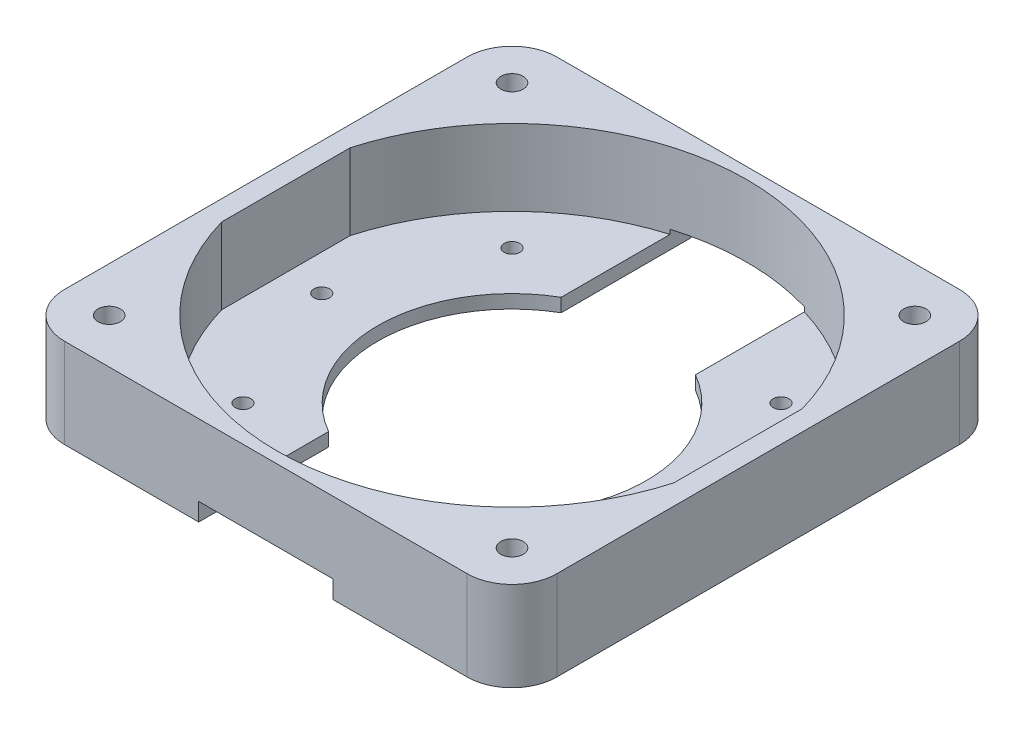
ISO-10303-21;
HEADER;
FILE_DESCRIPTION(('STEP AP214'),'2;1');
FILE_NAME('part.step','',(''),(''),'','','');
FILE_SCHEMA(('AUTOMOTIVE_DESIGN { 1 0 10303 214 1 1 1 1 }'));
ENDSEC;
DATA;
#1=APPLICATION_CONTEXT('core data for automotive mechanical design processes');
#2=APPLICATION_PROTOCOL_DEFINITION('international standard','automotive_design',2000,#1);
#3=PRODUCT_CONTEXT('',#1,'mechanical');
#4=PRODUCT('Part','Part','',(#3));
#5=PRODUCT_RELATED_PRODUCT_CATEGORY('part','',(#4));
#6=PRODUCT_DEFINITION_FORMATION('','',#4);
#7=PRODUCT_DEFINITION_CONTEXT('part definition',#1,'design');
#8=PRODUCT_DEFINITION('design','',#6,#7);
#9=PRODUCT_DEFINITION_SHAPE('','',#8);
#10=(LENGTH_UNIT() NAMED_UNIT(*) SI_UNIT(.MILLI.,.METRE.));
#11=(NAMED_UNIT(*) PLANE_ANGLE_UNIT() SI_UNIT($,.RADIAN.));
#12=(NAMED_UNIT(*) SI_UNIT($,.STERADIAN.) SOLID_ANGLE_UNIT());
#13=UNCERTAINTY_MEASURE_WITH_UNIT(LENGTH_MEASURE(1.E-05),#10,'distance_accuracy_value','');
#14=(GEOMETRIC_REPRESENTATION_CONTEXT(3) GLOBAL_UNCERTAINTY_ASSIGNED_CONTEXT((#13)) GLOBAL_UNIT_ASSIGNED_CONTEXT((#10,
#11,#12)) REPRESENTATION_CONTEXT('',''));
#15=CARTESIAN_POINT('',(0.,0.,0.));
#16=DIRECTION('',(0.,0.,1.));
#17=DIRECTION('',(1.,0.,0.));
#18=AXIS2_PLACEMENT_3D('',#15,#16,#17);
#19=CARTESIAN_POINT('',(45.,20.,45.));
#20=DIRECTION('',(0.,1.,0.));
#21=DIRECTION('',(0.,0.,1.));
#22=AXIS2_PLACEMENT_3D('',#19,#20,#21);
#23=CYLINDRICAL_SURFACE('',#22,10.);
#24=DIRECTION('',(0.,1.,0.));
#25=VECTOR('',#24,1.);
#26=CARTESIAN_POINT('',(45.,20.,55.));
#27=LINE('',#26,#25);
#28=CARTESIAN_POINT('',(45.,0.,55.));
#29=VERTEX_POINT('',#28);
#30=CARTESIAN_POINT('',(45.,20.,55.));
#31=VERTEX_POINT('',#30);
#32=EDGE_CURVE('E503',#29,#31,#27,.T.);
#33=ORIENTED_EDGE('',*,*,#32,.F.);
#34=CARTESIAN_POINT('',(45.,0.,45.));
#35=DIRECTION('',(0.,-1.,0.));
#36=DIRECTION('',(0.,0.,-1.));
#37=AXIS2_PLACEMENT_3D('',#34,#35,#36);
#38=CIRCLE('',#37,10.);
#39=CARTESIAN_POINT('',(55.,0.,45.));
#40=VERTEX_POINT('',#39);
#41=EDGE_CURVE('E511',#40,#29,#38,.T.);
#42=ORIENTED_EDGE('',*,*,#41,.F.);
#43=DIRECTION('',(0.,1.,0.));
#44=VECTOR('',#43,1.);
#45=CARTESIAN_POINT('',(55.,20.,45.));
#46=LINE('',#45,#44);
#47=CARTESIAN_POINT('',(55.,20.,45.));
#48=VERTEX_POINT('',#47);
#49=EDGE_CURVE('E507',#48,#40,#46,.F.);
#50=ORIENTED_EDGE('',*,*,#49,.F.);
#51=CARTESIAN_POINT('',(45.,20.,45.));
#52=DIRECTION('',(0.,-1.,0.));
#53=DIRECTION('',(0.,0.,-1.));
#54=AXIS2_PLACEMENT_3D('',#51,#52,#53);
#55=CIRCLE('',#54,10.);
#56=EDGE_CURVE('E67',#31,#48,#55,.F.);
#57=ORIENTED_EDGE('',*,*,#56,.F.);
#58=EDGE_LOOP('',(#33,#42,#50,#57));
#59=FACE_BOUND('',#58,.T.);
#60=ADVANCED_FACE('F44',(#59),#23,.T.);
#61=CARTESIAN_POINT('',(-45.,20.,45.));
#62=DIRECTION('',(0.,-1.,0.));
#63=DIRECTION('',(0.,0.,-1.));
#64=AXIS2_PLACEMENT_3D('',#61,#62,#63);
#65=CYLINDRICAL_SURFACE('',#64,10.);
#66=DIRECTION('',(0.,-1.,0.));
#67=VECTOR('',#66,1.);
#68=CARTESIAN_POINT('',(-45.,20.,55.));
#69=LINE('',#68,#67);
#70=CARTESIAN_POINT('',(-45.,20.,55.));
#71=VERTEX_POINT('',#70);
#72=CARTESIAN_POINT('',(-45.,0.,55.));
#73=VERTEX_POINT('',#72);
#74=EDGE_CURVE('E489',#71,#73,#69,.T.);
#75=ORIENTED_EDGE('',*,*,#74,.F.);
#76=CARTESIAN_POINT('',(-45.,20.,45.));
#77=DIRECTION('',(0.,-1.,0.));
#78=DIRECTION('',(0.,0.,-1.));
#79=AXIS2_PLACEMENT_3D('',#76,#77,#78);
#80=CIRCLE('',#79,10.);
#81=CARTESIAN_POINT('',(-55.,20.,45.));
#82=VERTEX_POINT('',#81);
#83=EDGE_CURVE('E497',#82,#71,#80,.F.);
#84=ORIENTED_EDGE('',*,*,#83,.F.);
#85=DIRECTION('',(0.,-1.,0.));
#86=VECTOR('',#85,1.);
#87=CARTESIAN_POINT('',(-55.,20.,45.));
#88=LINE('',#87,#86);
#89=CARTESIAN_POINT('',(-55.,0.,45.));
#90=VERTEX_POINT('',#89);
#91=EDGE_CURVE('E493',#90,#82,#88,.F.);
#92=ORIENTED_EDGE('',*,*,#91,.F.);
#93=CARTESIAN_POINT('',(-45.,0.,45.));
#94=DIRECTION('',(0.,-1.,0.));
#95=DIRECTION('',(0.,0.,-1.));
#96=AXIS2_PLACEMENT_3D('',#93,#94,#95);
#97=CIRCLE('',#96,10.);
#98=EDGE_CURVE('E500',#73,#90,#97,.T.);
#99=ORIENTED_EDGE('',*,*,#98,.F.);
#100=EDGE_LOOP('',(#75,#84,#92,#99));
#101=FACE_BOUND('',#100,.T.);
#102=ADVANCED_FACE('F600',(#101),#65,.T.);
#103=CARTESIAN_POINT('',(-45.,20.,-45.));
#104=DIRECTION('',(0.,1.,0.));
#105=DIRECTION('',(0.,0.,1.));
#106=AXIS2_PLACEMENT_3D('',#103,#104,#105);
#107=CYLINDRICAL_SURFACE('',#106,10.);
#108=DIRECTION('',(0.,1.,0.));
#109=VECTOR('',#108,1.);
#110=CARTESIAN_POINT('',(-45.,20.,-55.));
#111=LINE('',#110,#109);
#112=CARTESIAN_POINT('',(-45.,0.,-55.));
#113=VERTEX_POINT('',#112);
#114=CARTESIAN_POINT('',(-45.,20.,-55.));
#115=VERTEX_POINT('',#114);
#116=EDGE_CURVE('E475',#113,#115,#111,.T.);
#117=ORIENTED_EDGE('',*,*,#116,.F.);
#118=CARTESIAN_POINT('',(-45.,0.,-45.));
#119=DIRECTION('',(0.,-1.,0.));
#120=DIRECTION('',(0.,0.,-1.));
#121=AXIS2_PLACEMENT_3D('',#118,#119,#120);
#122=CIRCLE('',#121,10.);
#123=CARTESIAN_POINT('',(-55.,0.,-45.));
#124=VERTEX_POINT('',#123);
#125=EDGE_CURVE('E483',#124,#113,#122,.T.);
#126=ORIENTED_EDGE('',*,*,#125,.F.);
#127=DIRECTION('',(0.,1.,0.));
#128=VECTOR('',#127,1.);
#129=CARTESIAN_POINT('',(-55.,20.,-45.));
#130=LINE('',#129,#128);
#131=CARTESIAN_POINT('',(-55.,20.,-45.));
#132=VERTEX_POINT('',#131);
#133=EDGE_CURVE('E479',#132,#124,#130,.F.);
#134=ORIENTED_EDGE('',*,*,#133,.F.);
#135=CARTESIAN_POINT('',(-45.,20.,-45.));
#136=DIRECTION('',(0.,-1.,0.));
#137=DIRECTION('',(0.,0.,-1.));
#138=AXIS2_PLACEMENT_3D('',#135,#136,#137);
#139=CIRCLE('',#138,10.);
#140=EDGE_CURVE('E486',#115,#132,#139,.F.);
#141=ORIENTED_EDGE('',*,*,#140,.F.);
#142=EDGE_LOOP('',(#117,#126,#134,#141));
#143=FACE_BOUND('',#142,.T.);
#144=ADVANCED_FACE('F607',(#143),#107,.T.);
#145=CARTESIAN_POINT('',(45.,20.,-45.));
#146=DIRECTION('',(0.,-1.,0.));
#147=DIRECTION('',(0.,0.,-1.));
#148=AXIS2_PLACEMENT_3D('',#145,#146,#147);
#149=CYLINDRICAL_SURFACE('',#148,10.);
#150=DIRECTION('',(0.,-1.,0.));
#151=VECTOR('',#150,1.);
#152=CARTESIAN_POINT('',(45.,20.,-55.));
#153=LINE('',#152,#151);
#154=CARTESIAN_POINT('',(45.,20.,-55.));
#155=VERTEX_POINT('',#154);
#156=CARTESIAN_POINT('',(45.,0.,-55.));
#157=VERTEX_POINT('',#156);
#158=EDGE_CURVE('E460',#155,#157,#153,.T.);
#159=ORIENTED_EDGE('',*,*,#158,.F.);
#160=CARTESIAN_POINT('',(45.,20.,-45.));
#161=DIRECTION('',(0.,-1.,0.));
#162=DIRECTION('',(0.,0.,-1.));
#163=AXIS2_PLACEMENT_3D('',#160,#161,#162);
#164=CIRCLE('',#163,10.);
#165=CARTESIAN_POINT('',(55.,20.,-45.));
#166=VERTEX_POINT('',#165);
#167=EDGE_CURVE('E468',#166,#155,#164,.F.);
#168=ORIENTED_EDGE('',*,*,#167,.F.);
#169=DIRECTION('',(0.,-1.,0.));
#170=VECTOR('',#169,1.);
#171=CARTESIAN_POINT('',(55.,20.,-45.));
#172=LINE('',#171,#170);
#173=CARTESIAN_POINT('',(55.,0.,-45.));
#174=VERTEX_POINT('',#173);
#175=EDGE_CURVE('E464',#174,#166,#172,.F.);
#176=ORIENTED_EDGE('',*,*,#175,.F.);
#177=CARTESIAN_POINT('',(45.,0.,-45.));
#178=DIRECTION('',(0.,-1.,0.));
#179=DIRECTION('',(0.,0.,-1.));
#180=AXIS2_PLACEMENT_3D('',#177,#178,#179);
#181=CIRCLE('',#180,10.);
#182=EDGE_CURVE('E471',#157,#174,#181,.T.);
#183=ORIENTED_EDGE('',*,*,#182,.F.);
#184=EDGE_LOOP('',(#159,#168,#176,#183));
#185=FACE_BOUND('',#184,.T.);
#186=ADVANCED_FACE('F588',(#185),#149,.T.);
#187=CARTESIAN_POINT('',(0.,0.,0.));
#188=DIRECTION('',(0.,-1.,0.));
#189=DIRECTION('',(0.,0.,-1.));
#190=AXIS2_PLACEMENT_3D('',#187,#188,#189);
#191=PLANE('',#190);
#192=CARTESIAN_POINT('',(44.9999999999997,0.,45.0000000000003));
#193=DIRECTION('',(0.,1.,0.));
#194=DIRECTION('',(0.,0.,1.));
#195=AXIS2_PLACEMENT_3D('',#192,#193,#194);
#196=CIRCLE('',#195,2.50000000000001);
#197=CARTESIAN_POINT('',(44.9999999999997,0.,47.5000000000003));
#198=VERTEX_POINT('',#197);
#199=EDGE_CURVE('E284',#198,#198,#196,.T.);
#200=ORIENTED_EDGE('',*,*,#199,.T.);
#201=EDGE_LOOP('',(#200));
#202=FACE_BOUND('',#201,.T.);
#203=CARTESIAN_POINT('',(45.0000000000002,0.,-44.9999999999998));
#204=DIRECTION('',(0.,1.,0.));
#205=DIRECTION('',(0.,0.,1.));
#206=AXIS2_PLACEMENT_3D('',#203,#204,#205);
#207=CIRCLE('',#206,2.5);
#208=CARTESIAN_POINT('',(45.0000000000002,0.,-42.4999999999998));
#209=VERTEX_POINT('',#208);
#210=EDGE_CURVE('E303',#209,#209,#207,.T.);
#211=ORIENTED_EDGE('',*,*,#210,.T.);
#212=EDGE_LOOP('',(#211));
#213=FACE_BOUND('',#212,.T.);
#214=DIRECTION('',(0.,0.,-1.));
#215=VECTOR('',#214,1.);
#216=CARTESIAN_POINT('',(55.,0.,55.));
#217=LINE('',#216,#215);
#218=EDGE_CURVE('E427',#40,#174,#217,.T.);
#219=ORIENTED_EDGE('',*,*,#218,.F.);
#220=ORIENTED_EDGE('',*,*,#41,.T.);
#221=DIRECTION('',(1.,0.,0.));
#222=VECTOR('',#221,1.);
#223=CARTESIAN_POINT('',(-55.,0.,55.));
#224=LINE('',#223,#222);
#225=CARTESIAN_POINT('',(15.,0.,55.));
#226=VERTEX_POINT('',#225);
#227=EDGE_CURVE('E439',#226,#29,#224,.T.);
#228=ORIENTED_EDGE('',*,*,#227,.F.);
#229=DIRECTION('',(0.,0.,1.));
#230=VECTOR('',#229,1.);
#231=CARTESIAN_POINT('',(15.,0.,-57.1499317450354));
#232=LINE('',#231,#230);
#233=CARTESIAN_POINT('',(15.,0.,25.9807621135332));
#234=VERTEX_POINT('',#233);
#235=EDGE_CURVE('E307',#234,#226,#232,.T.);
#236=ORIENTED_EDGE('',*,*,#235,.F.);
#237=CARTESIAN_POINT('',(0.,0.,0.));
#238=DIRECTION('',(0.,-1.,0.));
#239=DIRECTION('',(0.,0.,-1.));
#240=AXIS2_PLACEMENT_3D('',#237,#238,#239);
#241=CIRCLE('',#240,30.);
#242=CARTESIAN_POINT('',(15.,0.,-25.9807621135332));
#243=VERTEX_POINT('',#242);
#244=EDGE_CURVE('E431',#243,#234,#241,.T.);
#245=ORIENTED_EDGE('',*,*,#244,.F.);
#246=CARTESIAN_POINT('',(15.,0.,-55.));
#247=VERTEX_POINT('',#246);
#248=EDGE_CURVE('E322',#247,#243,#232,.T.);
#249=ORIENTED_EDGE('',*,*,#248,.F.);
#250=DIRECTION('',(-1.,0.,0.));
#251=VECTOR('',#250,1.);
#252=CARTESIAN_POINT('',(-55.,0.,-55.));
#253=LINE('',#252,#251);
#254=EDGE_CURVE('E432',#157,#247,#253,.T.);
#255=ORIENTED_EDGE('',*,*,#254,.F.);
#256=ORIENTED_EDGE('',*,*,#182,.T.);
#257=EDGE_LOOP('',(#219,#220,#228,#236,#245,#249,#255,#256));
#258=FACE_BOUND('',#257,.T.);
#259=CARTESIAN_POINT('',(30.0520382004281,0.,30.0520382004284));
#260=DIRECTION('',(0.,-1.,0.));
#261=DIRECTION('',(0.,0.,-1.));
#262=AXIS2_PLACEMENT_3D('',#259,#260,#261);
#263=CIRCLE('',#262,1.75);
#264=CARTESIAN_POINT('',(30.0520382004281,0.,28.3020382004284));
#265=VERTEX_POINT('',#264);
#266=EDGE_CURVE('E398',#265,#265,#263,.T.);
#267=ORIENTED_EDGE('',*,*,#266,.F.);
#268=EDGE_LOOP('',(#267));
#269=FACE_BOUND('',#268,.T.);
#270=CARTESIAN_POINT('',(42.5,0.,1.48387956900833E-13));
#271=DIRECTION('',(0.,-1.,0.));
#272=DIRECTION('',(0.,0.,-1.));
#273=AXIS2_PLACEMENT_3D('',#270,#271,#272);
#274=CIRCLE('',#273,1.75);
#275=CARTESIAN_POINT('',(42.5,0.,-1.74999999999985));
#276=VERTEX_POINT('',#275);
#277=EDGE_CURVE('E402',#276,#276,#274,.T.);
#278=ORIENTED_EDGE('',*,*,#277,.F.);
#279=EDGE_LOOP('',(#278));
#280=FACE_BOUND('',#279,.T.);
#281=CARTESIAN_POINT('',(30.0520382004283,0.,-30.0520382004282));
#282=DIRECTION('',(0.,-1.,0.));
#283=DIRECTION('',(0.,0.,-1.));
#284=AXIS2_PLACEMENT_3D('',#281,#282,#283);
#285=CIRCLE('',#284,1.75);
#286=CARTESIAN_POINT('',(30.0520382004283,0.,-31.8020382004282));
#287=VERTEX_POINT('',#286);
#288=EDGE_CURVE('E406',#287,#287,#285,.T.);
#289=ORIENTED_EDGE('',*,*,#288,.F.);
#290=EDGE_LOOP('',(#289));
#291=FACE_BOUND('',#290,.T.);
#292=ADVANCED_FACE('F547',(#202,#213,#258,#269,#280,#291),#191,.T.);
#293=CARTESIAN_POINT('',(0.,3.,0.));
#294=DIRECTION('',(0.,1.,0.));
#295=DIRECTION('',(0.,0.,1.));
#296=AXIS2_PLACEMENT_3D('',#293,#294,#295);
#297=PLANE('',#296);
#298=CARTESIAN_POINT('',(0.,3.,0.));
#299=DIRECTION('',(0.,1.,0.));
#300=DIRECTION('',(0.,0.,1.));
#301=AXIS2_PLACEMENT_3D('',#298,#299,#300);
#302=CIRCLE('',#301,52.5);
#303=CARTESIAN_POINT('',(50.5,3.,-14.3527000944074));
#304=VERTEX_POINT('',#303);
#305=CARTESIAN_POINT('',(15.,3.,-50.3115294937453));
#306=VERTEX_POINT('',#305);
#307=EDGE_CURVE('E235',#304,#306,#302,.T.);
#308=ORIENTED_EDGE('',*,*,#307,.T.);
#309=DIRECTION('',(0.,0.,-1.));
#310=VECTOR('',#309,1.);
#311=CARTESIAN_POINT('',(15.,3.,0.));
#312=LINE('',#311,#310);
#313=CARTESIAN_POINT('',(15.,3.,-25.9807621135332));
#314=VERTEX_POINT('',#313);
#315=EDGE_CURVE('E340',#314,#306,#312,.T.);
#316=ORIENTED_EDGE('',*,*,#315,.F.);
#317=CARTESIAN_POINT('',(0.,3.,0.));
#318=DIRECTION('',(0.,1.,0.));
#319=DIRECTION('',(0.,0.,1.));
#320=AXIS2_PLACEMENT_3D('',#317,#318,#319);
#321=CIRCLE('',#320,30.);
#322=CARTESIAN_POINT('',(15.,3.,25.9807621135332));
#323=VERTEX_POINT('',#322);
#324=EDGE_CURVE('E382',#323,#314,#321,.T.);
#325=ORIENTED_EDGE('',*,*,#324,.F.);
#326=CARTESIAN_POINT('',(15.,3.,50.3115294937453));
#327=VERTEX_POINT('',#326);
#328=EDGE_CURVE('E213',#327,#323,#312,.T.);
#329=ORIENTED_EDGE('',*,*,#328,.F.);
#330=CARTESIAN_POINT('',(0.,3.,0.));
#331=DIRECTION('',(0.,1.,0.));
#332=DIRECTION('',(0.,0.,1.));
#333=AXIS2_PLACEMENT_3D('',#330,#331,#332);
#334=CIRCLE('',#333,52.5);
#335=CARTESIAN_POINT('',(50.5,3.,14.3527000944074));
#336=VERTEX_POINT('',#335);
#337=EDGE_CURVE('E206',#327,#336,#334,.T.);
#338=ORIENTED_EDGE('',*,*,#337,.T.);
#339=DIRECTION('',(0.,0.,-1.));
#340=VECTOR('',#339,1.);
#341=CARTESIAN_POINT('',(50.5,3.,14.3527000944074));
#342=LINE('',#341,#340);
#343=EDGE_CURVE('E211',#336,#304,#342,.T.);
#344=ORIENTED_EDGE('',*,*,#343,.T.);
#345=EDGE_LOOP('',(#308,#316,#325,#329,#338,#344));
#346=FACE_BOUND('',#345,.T.);
#347=CARTESIAN_POINT('',(30.0520382004281,3.,30.0520382004284));
#348=DIRECTION('',(0.,1.,0.));
#349=DIRECTION('',(0.,0.,1.));
#350=AXIS2_PLACEMENT_3D('',#347,#348,#349);
#351=CIRCLE('',#350,1.75);
#352=CARTESIAN_POINT('',(30.0520382004281,3.,31.8020382004284));
#353=VERTEX_POINT('',#352);
#354=EDGE_CURVE('E362',#353,#353,#351,.T.);
#355=ORIENTED_EDGE('',*,*,#354,.F.);
#356=EDGE_LOOP('',(#355));
#357=FACE_BOUND('',#356,.T.);
#358=CARTESIAN_POINT('',(42.5,3.,1.48387956900833E-13));
#359=DIRECTION('',(0.,1.,0.));
#360=DIRECTION('',(0.,0.,1.));
#361=AXIS2_PLACEMENT_3D('',#358,#359,#360);
#362=CIRCLE('',#361,1.75);
#363=CARTESIAN_POINT('',(42.5,3.,1.75000000000015));
#364=VERTEX_POINT('',#363);
#365=EDGE_CURVE('E375',#364,#364,#362,.T.);
#366=ORIENTED_EDGE('',*,*,#365,.F.);
#367=EDGE_LOOP('',(#366));
#368=FACE_BOUND('',#367,.T.);
#369=CARTESIAN_POINT('',(30.0520382004283,3.,-30.0520382004282));
#370=DIRECTION('',(0.,1.,0.));
#371=DIRECTION('',(0.,0.,1.));
#372=AXIS2_PLACEMENT_3D('',#369,#370,#371);
#373=CIRCLE('',#372,1.75);
#374=CARTESIAN_POINT('',(30.0520382004283,3.,-28.3020382004282));
#375=VERTEX_POINT('',#374);
#376=EDGE_CURVE('E370',#375,#375,#373,.T.);
#377=ORIENTED_EDGE('',*,*,#376,.F.);
#378=EDGE_LOOP('',(#377));
#379=FACE_BOUND('',#378,.T.);
#380=ADVANCED_FACE('F208',(#346,#357,#368,#379),#297,.T.);
#381=CARTESIAN_POINT('',(0.,-14.,0.));
#382=DIRECTION('',(0.,1.,0.));
#383=DIRECTION('',(0.,0.,1.));
#384=AXIS2_PLACEMENT_3D('',#381,#382,#383);
#385=CYLINDRICAL_SURFACE('',#384,30.);
#386=ORIENTED_EDGE('',*,*,#324,.T.);
#387=DIRECTION('',(0.,1.,0.));
#388=VECTOR('',#387,1.);
#389=CARTESIAN_POINT('',(15.,-14.,-25.9807621135332));
#390=LINE('',#389,#388);
#391=EDGE_CURVE('E456',#314,#243,#390,.F.);
#392=ORIENTED_EDGE('',*,*,#391,.T.);
#393=ORIENTED_EDGE('',*,*,#244,.T.);
#394=DIRECTION('',(0.,1.,0.));
#395=VECTOR('',#394,1.);
#396=CARTESIAN_POINT('',(15.,-14.,25.9807621135332));
#397=LINE('',#396,#395);
#398=EDGE_CURVE('E452',#234,#323,#397,.T.);
#399=ORIENTED_EDGE('',*,*,#398,.T.);
#400=EDGE_LOOP('',(#386,#392,#393,#399));
#401=FACE_BOUND('',#400,.T.);
#402=ADVANCED_FACE('F544',(#401),#385,.F.);
#403=CARTESIAN_POINT('',(0.,20.,0.));
#404=DIRECTION('',(0.,-1.,0.));
#405=DIRECTION('',(0.,0.,-1.));
#406=AXIS2_PLACEMENT_3D('',#403,#404,#405);
#407=PLANE('',#406);
#408=DIRECTION('',(0.,0.,-1.));
#409=VECTOR('',#408,1.);
#410=CARTESIAN_POINT('',(50.5,20.,14.3527000944074));
#411=LINE('',#410,#409);
#412=CARTESIAN_POINT('',(50.5,20.,14.3527000944074));
#413=VERTEX_POINT('',#412);
#414=CARTESIAN_POINT('',(50.5,20.,-14.3527000944074));
#415=VERTEX_POINT('',#414);
#416=EDGE_CURVE('E245',#413,#415,#411,.T.);
#417=ORIENTED_EDGE('',*,*,#416,.F.);
#418=CARTESIAN_POINT('',(0.,20.,0.));
#419=DIRECTION('',(0.,1.,0.));
#420=DIRECTION('',(0.,0.,1.));
#421=AXIS2_PLACEMENT_3D('',#418,#419,#420);
#422=CIRCLE('',#421,52.5);
#423=CARTESIAN_POINT('',(-50.5,20.,14.3527000944074));
#424=VERTEX_POINT('',#423);
#425=EDGE_CURVE('E59',#424,#413,#422,.T.);
#426=ORIENTED_EDGE('',*,*,#425,.F.);
#427=DIRECTION('',(0.,0.,1.));
#428=VECTOR('',#427,1.);
#429=CARTESIAN_POINT('',(-50.5,20.,-14.3527000944074));
#430=LINE('',#429,#428);
#431=CARTESIAN_POINT('',(-50.5,20.,-14.3527000944074));
#432=VERTEX_POINT('',#431);
#433=EDGE_CURVE('E217',#432,#424,#430,.T.);
#434=ORIENTED_EDGE('',*,*,#433,.F.);
#435=CARTESIAN_POINT('',(0.,20.,0.));
#436=DIRECTION('',(0.,1.,0.));
#437=DIRECTION('',(0.,0.,1.));
#438=AXIS2_PLACEMENT_3D('',#435,#436,#437);
#439=CIRCLE('',#438,52.5);
#440=EDGE_CURVE('E248',#415,#432,#439,.T.);
#441=ORIENTED_EDGE('',*,*,#440,.F.);
#442=EDGE_LOOP('',(#417,#426,#434,#441));
#443=FACE_BOUND('',#442,.T.);
#444=CARTESIAN_POINT('',(-45.,20.,-45.));
#445=DIRECTION('',(0.,1.,0.));
#446=DIRECTION('',(0.,0.,1.));
#447=AXIS2_PLACEMENT_3D('',#444,#445,#446);
#448=CIRCLE('',#447,2.5);
#449=CARTESIAN_POINT('',(-45.,20.,-42.5));
#450=VERTEX_POINT('',#449);
#451=EDGE_CURVE('E296',#450,#450,#448,.T.);
#452=ORIENTED_EDGE('',*,*,#451,.F.);
#453=EDGE_LOOP('',(#452));
#454=FACE_BOUND('',#453,.T.);
#455=CARTESIAN_POINT('',(-45.0000000000005,20.,44.9999999999995));
#456=DIRECTION('',(0.,1.,0.));
#457=DIRECTION('',(0.,0.,1.));
#458=AXIS2_PLACEMENT_3D('',#455,#456,#457);
#459=CIRCLE('',#458,2.5);
#460=CARTESIAN_POINT('',(-45.0000000000005,20.,47.4999999999995));
#461=VERTEX_POINT('',#460);
#462=EDGE_CURVE('E288',#461,#461,#459,.T.);
#463=ORIENTED_EDGE('',*,*,#462,.F.);
#464=EDGE_LOOP('',(#463));
#465=FACE_BOUND('',#464,.T.);
#466=CARTESIAN_POINT('',(44.9999999999997,20.,45.0000000000003));
#467=DIRECTION('',(0.,1.,0.));
#468=DIRECTION('',(0.,0.,1.));
#469=AXIS2_PLACEMENT_3D('',#466,#467,#468);
#470=CIRCLE('',#469,2.50000000000001);
#471=CARTESIAN_POINT('',(44.9999999999997,20.,47.5000000000003));
#472=VERTEX_POINT('',#471);
#473=EDGE_CURVE('E279',#472,#472,#470,.T.);
#474=ORIENTED_EDGE('',*,*,#473,.F.);
#475=EDGE_LOOP('',(#474));
#476=FACE_BOUND('',#475,.T.);
#477=CARTESIAN_POINT('',(45.0000000000002,20.,-44.9999999999998));
#478=DIRECTION('',(0.,1.,0.));
#479=DIRECTION('',(0.,0.,1.));
#480=AXIS2_PLACEMENT_3D('',#477,#478,#479);
#481=CIRCLE('',#480,2.5);
#482=CARTESIAN_POINT('',(45.0000000000002,20.,-42.4999999999998));
#483=VERTEX_POINT('',#482);
#484=EDGE_CURVE('E283',#483,#483,#481,.T.);
#485=ORIENTED_EDGE('',*,*,#484,.F.);
#486=EDGE_LOOP('',(#485));
#487=FACE_BOUND('',#486,.T.);
#488=DIRECTION('',(1.,0.,0.));
#489=VECTOR('',#488,1.);
#490=CARTESIAN_POINT('',(-55.,20.,55.));
#491=LINE('',#490,#489);
#492=EDGE_CURVE('E423',#71,#31,#491,.T.);
#493=ORIENTED_EDGE('',*,*,#492,.T.);
#494=ORIENTED_EDGE('',*,*,#56,.T.);
#495=DIRECTION('',(0.,0.,-1.));
#496=VECTOR('',#495,1.);
#497=CARTESIAN_POINT('',(55.,20.,55.));
#498=LINE('',#497,#496);
#499=EDGE_CURVE('E411',#48,#166,#498,.T.);
#500=ORIENTED_EDGE('',*,*,#499,.T.);
#501=ORIENTED_EDGE('',*,*,#167,.T.);
#502=DIRECTION('',(-1.,0.,0.));
#503=VECTOR('',#502,1.);
#504=CARTESIAN_POINT('',(-55.,20.,-55.));
#505=LINE('',#504,#503);
#506=EDGE_CURVE('E414',#155,#115,#505,.T.);
#507=ORIENTED_EDGE('',*,*,#506,.T.);
#508=ORIENTED_EDGE('',*,*,#140,.T.);
#509=DIRECTION('',(0.,0.,1.));
#510=VECTOR('',#509,1.);
#511=CARTESIAN_POINT('',(-55.,20.,55.));
#512=LINE('',#511,#510);
#513=EDGE_CURVE('E419',#132,#82,#512,.T.);
#514=ORIENTED_EDGE('',*,*,#513,.T.);
#515=ORIENTED_EDGE('',*,*,#83,.T.);
#516=EDGE_LOOP('',(#493,#494,#500,#501,#507,#508,#514,#515));
#517=FACE_BOUND('',#516,.T.);
#518=ADVANCED_FACE('F595',(#443,#454,#465,#476,#487,#517),#407,.F.);
#519=CARTESIAN_POINT('',(55.,20.,55.));
#520=DIRECTION('',(-1.,0.,0.));
#521=DIRECTION('',(0.,0.,1.));
#522=AXIS2_PLACEMENT_3D('',#519,#520,#521);
#523=PLANE('',#522);
#524=ORIENTED_EDGE('',*,*,#499,.F.);
#525=ORIENTED_EDGE('',*,*,#49,.T.);
#526=ORIENTED_EDGE('',*,*,#218,.T.);
#527=ORIENTED_EDGE('',*,*,#175,.T.);
#528=EDGE_LOOP('',(#524,#525,#526,#527));
#529=FACE_BOUND('',#528,.T.);
#530=ADVANCED_FACE('F591',(#529),#523,.F.);
#531=CARTESIAN_POINT('',(-55.,20.,-55.));
#532=DIRECTION('',(0.,0.,1.));
#533=DIRECTION('',(1.,0.,0.));
#534=AXIS2_PLACEMENT_3D('',#531,#532,#533);
#535=PLANE('',#534);
#536=CARTESIAN_POINT('',(-15.,0.,-55.));
#537=VERTEX_POINT('',#536);
#538=EDGE_CURVE('E430',#537,#113,#253,.T.);
#539=ORIENTED_EDGE('',*,*,#538,.T.);
#540=ORIENTED_EDGE('',*,*,#116,.T.);
#541=ORIENTED_EDGE('',*,*,#506,.F.);
#542=ORIENTED_EDGE('',*,*,#158,.T.);
#543=ORIENTED_EDGE('',*,*,#254,.T.);
#544=DIRECTION('',(0.,1.,0.));
#545=VECTOR('',#544,1.);
#546=CARTESIAN_POINT('',(15.,20.,-55.));
#547=LINE('',#546,#545);
#548=CARTESIAN_POINT('',(15.,4.,-55.));
#549=VERTEX_POINT('',#548);
#550=EDGE_CURVE('E345',#247,#549,#547,.T.);
#551=ORIENTED_EDGE('',*,*,#550,.T.);
#552=DIRECTION('',(-1.,0.,0.));
#553=VECTOR('',#552,1.);
#554=CARTESIAN_POINT('',(-55.,4.,-55.));
#555=LINE('',#554,#553);
#556=CARTESIAN_POINT('',(-15.,4.,-55.));
#557=VERTEX_POINT('',#556);
#558=EDGE_CURVE('E353',#549,#557,#555,.T.);
#559=ORIENTED_EDGE('',*,*,#558,.T.);
#560=DIRECTION('',(0.,-1.,0.));
#561=VECTOR('',#560,1.);
#562=CARTESIAN_POINT('',(-15.,20.,-55.));
#563=LINE('',#562,#561);
#564=EDGE_CURVE('E334',#557,#537,#563,.T.);
#565=ORIENTED_EDGE('',*,*,#564,.T.);
#566=EDGE_LOOP('',(#539,#540,#541,#542,#543,#551,#559,#565));
#567=FACE_BOUND('',#566,.T.);
#568=ADVANCED_FACE('F582',(#567),#535,.F.);
#569=CARTESIAN_POINT('',(-55.,20.,55.));
#570=DIRECTION('',(1.,0.,0.));
#571=DIRECTION('',(0.,0.,-1.));
#572=AXIS2_PLACEMENT_3D('',#569,#570,#571);
#573=PLANE('',#572);
#574=DIRECTION('',(0.,0.,1.));
#575=VECTOR('',#574,1.);
#576=CARTESIAN_POINT('',(-55.,0.,55.));
#577=LINE('',#576,#575);
#578=EDGE_CURVE('E435',#124,#90,#577,.T.);
#579=ORIENTED_EDGE('',*,*,#578,.T.);
#580=ORIENTED_EDGE('',*,*,#91,.T.);
#581=ORIENTED_EDGE('',*,*,#513,.F.);
#582=ORIENTED_EDGE('',*,*,#133,.T.);
#583=EDGE_LOOP('',(#579,#580,#581,#582));
#584=FACE_BOUND('',#583,.T.);
#585=ADVANCED_FACE('F604',(#584),#573,.F.);
#586=CARTESIAN_POINT('',(-55.,20.,55.));
#587=DIRECTION('',(0.,0.,-1.));
#588=DIRECTION('',(-1.,0.,0.));
#589=AXIS2_PLACEMENT_3D('',#586,#587,#588);
#590=PLANE('',#589);
#591=ORIENTED_EDGE('',*,*,#227,.T.);
#592=ORIENTED_EDGE('',*,*,#32,.T.);
#593=ORIENTED_EDGE('',*,*,#492,.F.);
#594=ORIENTED_EDGE('',*,*,#74,.T.);
#595=CARTESIAN_POINT('',(-15.,0.,55.));
#596=VERTEX_POINT('',#595);
#597=EDGE_CURVE('E415',#73,#596,#224,.T.);
#598=ORIENTED_EDGE('',*,*,#597,.T.);
#599=DIRECTION('',(0.,1.,0.));
#600=VECTOR('',#599,1.);
#601=CARTESIAN_POINT('',(-15.,20.,55.));
#602=LINE('',#601,#600);
#603=CARTESIAN_POINT('',(-15.,4.,55.));
#604=VERTEX_POINT('',#603);
#605=EDGE_CURVE('E330',#596,#604,#602,.T.);
#606=ORIENTED_EDGE('',*,*,#605,.T.);
#607=DIRECTION('',(1.,0.,0.));
#608=VECTOR('',#607,1.);
#609=CARTESIAN_POINT('',(-55.,4.,55.));
#610=LINE('',#609,#608);
#611=CARTESIAN_POINT('',(15.,4.,55.));
#612=VERTEX_POINT('',#611);
#613=EDGE_CURVE('E349',#604,#612,#610,.T.);
#614=ORIENTED_EDGE('',*,*,#613,.T.);
#615=DIRECTION('',(0.,-1.,0.));
#616=VECTOR('',#615,1.);
#617=CARTESIAN_POINT('',(15.,20.,55.));
#618=LINE('',#617,#616);
#619=EDGE_CURVE('E341',#612,#226,#618,.T.);
#620=ORIENTED_EDGE('',*,*,#619,.T.);
#621=EDGE_LOOP('',(#591,#592,#593,#594,#598,#606,#614,#620));
#622=FACE_BOUND('',#621,.T.);
#623=ADVANCED_FACE('F555',(#622),#590,.F.);
#624=CARTESIAN_POINT('',(-45.,0.,-45.));
#625=DIRECTION('',(0.,1.,0.));
#626=DIRECTION('',(0.,0.,1.));
#627=AXIS2_PLACEMENT_3D('',#624,#625,#626);
#628=CIRCLE('',#627,2.5);
#629=CARTESIAN_POINT('',(-45.,0.,-42.5));
#630=VERTEX_POINT('',#629);
#631=EDGE_CURVE('E278',#630,#630,#628,.T.);
#632=ORIENTED_EDGE('',*,*,#631,.T.);
#633=EDGE_LOOP('',(#632));
#634=FACE_BOUND('',#633,.T.);
#635=CARTESIAN_POINT('',(-45.0000000000005,0.,44.9999999999995));
#636=DIRECTION('',(0.,1.,0.));
#637=DIRECTION('',(0.,0.,1.));
#638=AXIS2_PLACEMENT_3D('',#635,#636,#637);
#639=CIRCLE('',#638,2.5);
#640=CARTESIAN_POINT('',(-45.0000000000005,0.,47.4999999999995));
#641=VERTEX_POINT('',#640);
#642=EDGE_CURVE('E292',#641,#641,#639,.T.);
#643=ORIENTED_EDGE('',*,*,#642,.T.);
#644=EDGE_LOOP('',(#643));
#645=FACE_BOUND('',#644,.T.);
#646=ORIENTED_EDGE('',*,*,#597,.F.);
#647=ORIENTED_EDGE('',*,*,#98,.T.);
#648=ORIENTED_EDGE('',*,*,#578,.F.);
#649=ORIENTED_EDGE('',*,*,#125,.T.);
#650=ORIENTED_EDGE('',*,*,#538,.F.);
#651=DIRECTION('',(0.,0.,-1.));
#652=VECTOR('',#651,1.);
#653=CARTESIAN_POINT('',(-15.,0.,-57.1499317450354));
#654=LINE('',#653,#652);
#655=CARTESIAN_POINT('',(-15.,0.,-25.9807621135332));
#656=VERTEX_POINT('',#655);
#657=EDGE_CURVE('E323',#656,#537,#654,.T.);
#658=ORIENTED_EDGE('',*,*,#657,.F.);
#659=CARTESIAN_POINT('',(-15.,0.,25.9807621135332));
#660=VERTEX_POINT('',#659);
#661=EDGE_CURVE('E410',#660,#656,#241,.T.);
#662=ORIENTED_EDGE('',*,*,#661,.F.);
#663=EDGE_CURVE('E315',#596,#660,#654,.T.);
#664=ORIENTED_EDGE('',*,*,#663,.F.);
#665=EDGE_LOOP('',(#646,#647,#648,#649,#650,#658,#662,#664));
#666=FACE_BOUND('',#665,.T.);
#667=CARTESIAN_POINT('',(-30.0520382004285,0.,30.052038200428));
#668=DIRECTION('',(0.,-1.,0.));
#669=DIRECTION('',(0.,0.,-1.));
#670=AXIS2_PLACEMENT_3D('',#667,#668,#669);
#671=CIRCLE('',#670,1.75);
#672=CARTESIAN_POINT('',(-30.0520382004285,0.,28.302038200428));
#673=VERTEX_POINT('',#672);
#674=EDGE_CURVE('E394',#673,#673,#671,.T.);
#675=ORIENTED_EDGE('',*,*,#674,.F.);
#676=EDGE_LOOP('',(#675));
#677=FACE_BOUND('',#676,.T.);
#678=CARTESIAN_POINT('',(-42.5,0.,-4.451638707025E-13));
#679=DIRECTION('',(0.,-1.,0.));
#680=DIRECTION('',(0.,0.,-1.));
#681=AXIS2_PLACEMENT_3D('',#678,#679,#680);
#682=CIRCLE('',#681,1.75);
#683=CARTESIAN_POINT('',(-42.5,0.,-1.75000000000044));
#684=VERTEX_POINT('',#683);
#685=EDGE_CURVE('E390',#684,#684,#682,.T.);
#686=ORIENTED_EDGE('',*,*,#685,.F.);
#687=EDGE_LOOP('',(#686));
#688=FACE_BOUND('',#687,.T.);
#689=CARTESIAN_POINT('',(-30.0520382004279,0.,-30.0520382004286));
#690=DIRECTION('',(0.,-1.,0.));
#691=DIRECTION('',(0.,0.,-1.));
#692=AXIS2_PLACEMENT_3D('',#689,#690,#691);
#693=CIRCLE('',#692,1.75);
#694=CARTESIAN_POINT('',(-30.0520382004279,0.,-31.8020382004286));
#695=VERTEX_POINT('',#694);
#696=EDGE_CURVE('E386',#695,#695,#693,.T.);
#697=ORIENTED_EDGE('',*,*,#696,.F.);
#698=EDGE_LOOP('',(#697));
#699=FACE_BOUND('',#698,.T.);
#700=ADVANCED_FACE('F560',(#634,#645,#666,#677,#688,#699),#191,.T.);
#701=CARTESIAN_POINT('',(-50.5,3.,14.3527000944074));
#702=VERTEX_POINT('',#701);
#703=CARTESIAN_POINT('',(-15.,3.,50.3115294937453));
#704=VERTEX_POINT('',#703);
#705=EDGE_CURVE('E216',#702,#704,#334,.T.);
#706=ORIENTED_EDGE('',*,*,#705,.T.);
#707=DIRECTION('',(0.,0.,1.));
#708=VECTOR('',#707,1.);
#709=CARTESIAN_POINT('',(-15.,3.,0.));
#710=LINE('',#709,#708);
#711=CARTESIAN_POINT('',(-15.,3.,25.9807621135332));
#712=VERTEX_POINT('',#711);
#713=EDGE_CURVE('E329',#712,#704,#710,.T.);
#714=ORIENTED_EDGE('',*,*,#713,.F.);
#715=CARTESIAN_POINT('',(-15.,3.,-25.9807621135332));
#716=VERTEX_POINT('',#715);
#717=EDGE_CURVE('E374',#716,#712,#321,.T.);
#718=ORIENTED_EDGE('',*,*,#717,.F.);
#719=CARTESIAN_POINT('',(-15.,3.,-50.3115294937453));
#720=VERTEX_POINT('',#719);
#721=EDGE_CURVE('E326',#720,#716,#710,.T.);
#722=ORIENTED_EDGE('',*,*,#721,.F.);
#723=CARTESIAN_POINT('',(-50.5,3.,-14.3527000944074));
#724=VERTEX_POINT('',#723);
#725=EDGE_CURVE('E231',#720,#724,#302,.T.);
#726=ORIENTED_EDGE('',*,*,#725,.T.);
#727=DIRECTION('',(0.,0.,1.));
#728=VECTOR('',#727,1.);
#729=CARTESIAN_POINT('',(-50.5,3.,-14.3527000944074));
#730=LINE('',#729,#728);
#731=EDGE_CURVE('E226',#724,#702,#730,.T.);
#732=ORIENTED_EDGE('',*,*,#731,.T.);
#733=EDGE_LOOP('',(#706,#714,#718,#722,#726,#732));
#734=FACE_BOUND('',#733,.T.);
#735=CARTESIAN_POINT('',(-30.0520382004285,3.,30.052038200428));
#736=DIRECTION('',(0.,1.,0.));
#737=DIRECTION('',(0.,0.,1.));
#738=AXIS2_PLACEMENT_3D('',#735,#736,#737);
#739=CIRCLE('',#738,1.75);
#740=CARTESIAN_POINT('',(-30.0520382004285,3.,31.802038200428));
#741=VERTEX_POINT('',#740);
#742=EDGE_CURVE('E358',#741,#741,#739,.T.);
#743=ORIENTED_EDGE('',*,*,#742,.F.);
#744=EDGE_LOOP('',(#743));
#745=FACE_BOUND('',#744,.T.);
#746=CARTESIAN_POINT('',(-42.5,3.,-4.451638707025E-13));
#747=DIRECTION('',(0.,1.,0.));
#748=DIRECTION('',(0.,0.,1.));
#749=AXIS2_PLACEMENT_3D('',#746,#747,#748);
#750=CIRCLE('',#749,1.75);
#751=CARTESIAN_POINT('',(-42.5,3.,1.74999999999955));
#752=VERTEX_POINT('',#751);
#753=EDGE_CURVE('E363',#752,#752,#750,.T.);
#754=ORIENTED_EDGE('',*,*,#753,.F.);
#755=EDGE_LOOP('',(#754));
#756=FACE_BOUND('',#755,.T.);
#757=CARTESIAN_POINT('',(-30.0520382004279,3.,-30.0520382004286));
#758=DIRECTION('',(0.,1.,0.));
#759=DIRECTION('',(0.,0.,1.));
#760=AXIS2_PLACEMENT_3D('',#757,#758,#759);
#761=CIRCLE('',#760,1.75);
#762=CARTESIAN_POINT('',(-30.0520382004279,3.,-28.3020382004286));
#763=VERTEX_POINT('',#762);
#764=EDGE_CURVE('E357',#763,#763,#761,.T.);
#765=ORIENTED_EDGE('',*,*,#764,.F.);
#766=EDGE_LOOP('',(#765));
#767=FACE_BOUND('',#766,.T.);
#768=ADVANCED_FACE('F660',(#734,#745,#756,#767),#297,.T.);
#769=CARTESIAN_POINT('',(-30.0520382004279,-14.,-30.0520382004286));
#770=DIRECTION('',(0.,1.,0.));
#771=DIRECTION('',(0.,0.,1.));
#772=AXIS2_PLACEMENT_3D('',#769,#770,#771);
#773=CYLINDRICAL_SURFACE('',#772,1.75);
#774=ORIENTED_EDGE('',*,*,#696,.T.);
#775=EDGE_LOOP('',(#774));
#776=FACE_BOUND('',#775,.T.);
#777=ORIENTED_EDGE('',*,*,#764,.T.);
#778=EDGE_LOOP('',(#777));
#779=FACE_BOUND('',#778,.T.);
#780=ADVANCED_FACE('F676',(#776,#779),#773,.F.);
#781=CARTESIAN_POINT('',(-42.5,-14.,-4.451638707025E-13));
#782=DIRECTION('',(0.,1.,0.));
#783=DIRECTION('',(0.,0.,1.));
#784=AXIS2_PLACEMENT_3D('',#781,#782,#783);
#785=CYLINDRICAL_SURFACE('',#784,1.75);
#786=ORIENTED_EDGE('',*,*,#685,.T.);
#787=EDGE_LOOP('',(#786));
#788=FACE_BOUND('',#787,.T.);
#789=ORIENTED_EDGE('',*,*,#753,.T.);
#790=EDGE_LOOP('',(#789));
#791=FACE_BOUND('',#790,.T.);
#792=ADVANCED_FACE('F857',(#788,#791),#785,.F.);
#793=CARTESIAN_POINT('',(-30.0520382004285,-14.,30.052038200428));
#794=DIRECTION('',(0.,1.,0.));
#795=DIRECTION('',(0.,0.,1.));
#796=AXIS2_PLACEMENT_3D('',#793,#794,#795);
#797=CYLINDRICAL_SURFACE('',#796,1.75);
#798=ORIENTED_EDGE('',*,*,#674,.T.);
#799=EDGE_LOOP('',(#798));
#800=FACE_BOUND('',#799,.T.);
#801=ORIENTED_EDGE('',*,*,#742,.T.);
#802=EDGE_LOOP('',(#801));
#803=FACE_BOUND('',#802,.T.);
#804=ADVANCED_FACE('F848',(#800,#803),#797,.F.);
#805=CARTESIAN_POINT('',(30.0520382004281,-14.,30.0520382004284));
#806=DIRECTION('',(0.,1.,0.));
#807=DIRECTION('',(0.,0.,1.));
#808=AXIS2_PLACEMENT_3D('',#805,#806,#807);
#809=CYLINDRICAL_SURFACE('',#808,1.75);
#810=ORIENTED_EDGE('',*,*,#266,.T.);
#811=EDGE_LOOP('',(#810));
#812=FACE_BOUND('',#811,.T.);
#813=ORIENTED_EDGE('',*,*,#354,.T.);
#814=EDGE_LOOP('',(#813));
#815=FACE_BOUND('',#814,.T.);
#816=ADVANCED_FACE('F839',(#812,#815),#809,.F.);
#817=CARTESIAN_POINT('',(42.5,-14.,1.48387956900833E-13));
#818=DIRECTION('',(0.,1.,0.));
#819=DIRECTION('',(0.,0.,1.));
#820=AXIS2_PLACEMENT_3D('',#817,#818,#819);
#821=CYLINDRICAL_SURFACE('',#820,1.75);
#822=ORIENTED_EDGE('',*,*,#277,.T.);
#823=EDGE_LOOP('',(#822));
#824=FACE_BOUND('',#823,.T.);
#825=ORIENTED_EDGE('',*,*,#365,.T.);
#826=EDGE_LOOP('',(#825));
#827=FACE_BOUND('',#826,.T.);
#828=ADVANCED_FACE('F830',(#824,#827),#821,.F.);
#829=CARTESIAN_POINT('',(30.0520382004283,-14.,-30.0520382004282));
#830=DIRECTION('',(0.,1.,0.));
#831=DIRECTION('',(0.,0.,1.));
#832=AXIS2_PLACEMENT_3D('',#829,#830,#831);
#833=CYLINDRICAL_SURFACE('',#832,1.75);
#834=ORIENTED_EDGE('',*,*,#288,.T.);
#835=EDGE_LOOP('',(#834));
#836=FACE_BOUND('',#835,.T.);
#837=ORIENTED_EDGE('',*,*,#376,.T.);
#838=EDGE_LOOP('',(#837));
#839=FACE_BOUND('',#838,.T.);
#840=ADVANCED_FACE('F817',(#836,#839),#833,.F.);
#841=ORIENTED_EDGE('',*,*,#717,.T.);
#842=DIRECTION('',(0.,1.,0.));
#843=VECTOR('',#842,1.);
#844=CARTESIAN_POINT('',(-15.,-14.,25.9807621135332));
#845=LINE('',#844,#843);
#846=EDGE_CURVE('E448',#712,#660,#845,.F.);
#847=ORIENTED_EDGE('',*,*,#846,.T.);
#848=ORIENTED_EDGE('',*,*,#661,.T.);
#849=DIRECTION('',(0.,1.,0.));
#850=VECTOR('',#849,1.);
#851=CARTESIAN_POINT('',(-15.,-14.,-25.9807621135332));
#852=LINE('',#851,#850);
#853=EDGE_CURVE('E426',#656,#716,#852,.T.);
#854=ORIENTED_EDGE('',*,*,#853,.T.);
#855=EDGE_LOOP('',(#841,#847,#848,#854));
#856=FACE_BOUND('',#855,.T.);
#857=ADVANCED_FACE('F684',(#856),#385,.F.);
#858=CARTESIAN_POINT('',(-15.,4.,-57.1499317450354));
#859=DIRECTION('',(-1.,0.,0.));
#860=DIRECTION('',(0.,0.,1.));
#861=AXIS2_PLACEMENT_3D('',#858,#859,#860);
#862=PLANE('',#861);
#863=DIRECTION('',(0.,0.,-1.));
#864=VECTOR('',#863,1.);
#865=CARTESIAN_POINT('',(-15.,4.,-57.1499317450354));
#866=LINE('',#865,#864);
#867=CARTESIAN_POINT('',(-15.,4.,-50.3115294937453));
#868=VERTEX_POINT('',#867);
#869=EDGE_CURVE('E316',#868,#557,#866,.T.);
#870=ORIENTED_EDGE('',*,*,#869,.F.);
#871=DIRECTION('',(0.,1.,0.));
#872=VECTOR('',#871,1.);
#873=CARTESIAN_POINT('',(-15.,3.,-50.3115294937453));
#874=LINE('',#873,#872);
#875=EDGE_CURVE('E274',#868,#720,#874,.F.);
#876=ORIENTED_EDGE('',*,*,#875,.T.);
#877=ORIENTED_EDGE('',*,*,#721,.T.);
#878=ORIENTED_EDGE('',*,*,#853,.F.);
#879=ORIENTED_EDGE('',*,*,#657,.T.);
#880=ORIENTED_EDGE('',*,*,#564,.F.);
#881=EDGE_LOOP('',(#870,#876,#877,#878,#879,#880));
#882=FACE_BOUND('',#881,.T.);
#883=ADVANCED_FACE('F579',(#882),#862,.F.);
#884=CARTESIAN_POINT('',(15.,4.,-57.1499317450354));
#885=DIRECTION('',(1.,0.,0.));
#886=DIRECTION('',(0.,0.,-1.));
#887=AXIS2_PLACEMENT_3D('',#884,#885,#886);
#888=PLANE('',#887);
#889=ORIENTED_EDGE('',*,*,#315,.T.);
#890=DIRECTION('',(0.,1.,0.));
#891=VECTOR('',#890,1.);
#892=CARTESIAN_POINT('',(15.,3.,-50.3115294937453));
#893=LINE('',#892,#891);
#894=CARTESIAN_POINT('',(15.,4.,-50.3115294937453));
#895=VERTEX_POINT('',#894);
#896=EDGE_CURVE('E270',#306,#895,#893,.T.);
#897=ORIENTED_EDGE('',*,*,#896,.T.);
#898=DIRECTION('',(0.,0.,1.));
#899=VECTOR('',#898,1.);
#900=CARTESIAN_POINT('',(15.,4.,-57.1499317450354));
#901=LINE('',#900,#899);
#902=EDGE_CURVE('E314',#549,#895,#901,.T.);
#903=ORIENTED_EDGE('',*,*,#902,.F.);
#904=ORIENTED_EDGE('',*,*,#550,.F.);
#905=ORIENTED_EDGE('',*,*,#248,.T.);
#906=ORIENTED_EDGE('',*,*,#391,.F.);
#907=EDGE_LOOP('',(#889,#897,#903,#904,#905,#906));
#908=FACE_BOUND('',#907,.T.);
#909=ADVANCED_FACE('F537',(#908),#888,.F.);
#910=CARTESIAN_POINT('',(0.,4.,0.));
#911=DIRECTION('',(0.,1.,0.));
#912=DIRECTION('',(0.,0.,1.));
#913=AXIS2_PLACEMENT_3D('',#910,#911,#912);
#914=PLANE('',#913);
#915=ORIENTED_EDGE('',*,*,#902,.T.);
#916=CARTESIAN_POINT('',(0.,4.,0.));
#917=DIRECTION('',(0.,1.,0.));
#918=DIRECTION('',(0.,0.,1.));
#919=AXIS2_PLACEMENT_3D('',#916,#917,#918);
#920=CIRCLE('',#919,52.5);
#921=EDGE_CURVE('E11',#895,#868,#920,.T.);
#922=ORIENTED_EDGE('',*,*,#921,.T.);
#923=ORIENTED_EDGE('',*,*,#869,.T.);
#924=ORIENTED_EDGE('',*,*,#558,.F.);
#925=EDGE_LOOP('',(#915,#922,#923,#924));
#926=FACE_BOUND('',#925,.T.);
#927=ADVANCED_FACE('F576',(#926),#914,.F.);
#928=CARTESIAN_POINT('',(-15.,4.,50.3115294937453));
#929=VERTEX_POINT('',#928);
#930=EDGE_CURVE('E319',#604,#929,#866,.T.);
#931=ORIENTED_EDGE('',*,*,#930,.T.);
#932=CARTESIAN_POINT('',(0.,4.,0.));
#933=DIRECTION('',(0.,1.,0.));
#934=DIRECTION('',(0.,0.,1.));
#935=AXIS2_PLACEMENT_3D('',#932,#933,#934);
#936=CIRCLE('',#935,52.5);
#937=CARTESIAN_POINT('',(15.,4.,50.3115294937453));
#938=VERTEX_POINT('',#937);
#939=EDGE_CURVE('E258',#929,#938,#936,.T.);
#940=ORIENTED_EDGE('',*,*,#939,.T.);
#941=EDGE_CURVE('E311',#938,#612,#901,.T.);
#942=ORIENTED_EDGE('',*,*,#941,.T.);
#943=ORIENTED_EDGE('',*,*,#613,.F.);
#944=EDGE_LOOP('',(#931,#940,#942,#943));
#945=FACE_BOUND('',#944,.T.);
#946=ADVANCED_FACE('F526',(#945),#914,.F.);
#947=ORIENTED_EDGE('',*,*,#941,.F.);
#948=DIRECTION('',(0.,1.,0.));
#949=VECTOR('',#948,1.);
#950=CARTESIAN_POINT('',(15.,3.,50.3115294937453));
#951=LINE('',#950,#949);
#952=EDGE_CURVE('E267',#938,#327,#951,.F.);
#953=ORIENTED_EDGE('',*,*,#952,.T.);
#954=ORIENTED_EDGE('',*,*,#328,.T.);
#955=ORIENTED_EDGE('',*,*,#398,.F.);
#956=ORIENTED_EDGE('',*,*,#235,.T.);
#957=ORIENTED_EDGE('',*,*,#619,.F.);
#958=EDGE_LOOP('',(#947,#953,#954,#955,#956,#957));
#959=FACE_BOUND('',#958,.T.);
#960=ADVANCED_FACE('F553',(#959),#888,.F.);
#961=ORIENTED_EDGE('',*,*,#713,.T.);
#962=DIRECTION('',(0.,1.,0.));
#963=VECTOR('',#962,1.);
#964=CARTESIAN_POINT('',(-15.,3.,50.3115294937453));
#965=LINE('',#964,#963);
#966=EDGE_CURVE('E52',#704,#929,#965,.T.);
#967=ORIENTED_EDGE('',*,*,#966,.T.);
#968=ORIENTED_EDGE('',*,*,#930,.F.);
#969=ORIENTED_EDGE('',*,*,#605,.F.);
#970=ORIENTED_EDGE('',*,*,#663,.T.);
#971=ORIENTED_EDGE('',*,*,#846,.F.);
#972=EDGE_LOOP('',(#961,#967,#968,#969,#970,#971));
#973=FACE_BOUND('',#972,.T.);
#974=ADVANCED_FACE('F521',(#973),#862,.F.);
#975=CARTESIAN_POINT('',(-45.0000000000005,0.,44.9999999999995));
#976=DIRECTION('',(0.,1.,0.));
#977=DIRECTION('',(0.,0.,1.));
#978=AXIS2_PLACEMENT_3D('',#975,#976,#977);
#979=CYLINDRICAL_SURFACE('',#978,2.5);
#980=ORIENTED_EDGE('',*,*,#642,.F.);
#981=EDGE_LOOP('',(#980));
#982=FACE_BOUND('',#981,.T.);
#983=ORIENTED_EDGE('',*,*,#462,.T.);
#984=EDGE_LOOP('',(#983));
#985=FACE_BOUND('',#984,.T.);
#986=ADVANCED_FACE('F717',(#982,#985),#979,.F.);
#987=CARTESIAN_POINT('',(-45.,0.,-45.));
#988=DIRECTION('',(0.,1.,0.));
#989=DIRECTION('',(0.,0.,1.));
#990=AXIS2_PLACEMENT_3D('',#987,#988,#989);
#991=CYLINDRICAL_SURFACE('',#990,2.5);
#992=ORIENTED_EDGE('',*,*,#631,.F.);
#993=EDGE_LOOP('',(#992));
#994=FACE_BOUND('',#993,.T.);
#995=ORIENTED_EDGE('',*,*,#451,.T.);
#996=EDGE_LOOP('',(#995));
#997=FACE_BOUND('',#996,.T.);
#998=ADVANCED_FACE('F783',(#994,#997),#991,.F.);
#999=CARTESIAN_POINT('',(45.0000000000002,0.,-44.9999999999998));
#1000=DIRECTION('',(0.,1.,0.));
#1001=DIRECTION('',(0.,0.,1.));
#1002=AXIS2_PLACEMENT_3D('',#999,#1000,#1001);
#1003=CYLINDRICAL_SURFACE('',#1002,2.5);
#1004=ORIENTED_EDGE('',*,*,#210,.F.);
#1005=EDGE_LOOP('',(#1004));
#1006=FACE_BOUND('',#1005,.T.);
#1007=ORIENTED_EDGE('',*,*,#484,.T.);
#1008=EDGE_LOOP('',(#1007));
#1009=FACE_BOUND('',#1008,.T.);
#1010=ADVANCED_FACE('F774',(#1006,#1009),#1003,.F.);
#1011=CARTESIAN_POINT('',(44.9999999999997,0.,45.0000000000003));
#1012=DIRECTION('',(0.,1.,0.));
#1013=DIRECTION('',(0.,0.,1.));
#1014=AXIS2_PLACEMENT_3D('',#1011,#1012,#1013);
#1015=CYLINDRICAL_SURFACE('',#1014,2.50000000000001);
#1016=ORIENTED_EDGE('',*,*,#199,.F.);
#1017=EDGE_LOOP('',(#1016));
#1018=FACE_BOUND('',#1017,.T.);
#1019=ORIENTED_EDGE('',*,*,#473,.T.);
#1020=EDGE_LOOP('',(#1019));
#1021=FACE_BOUND('',#1020,.T.);
#1022=ADVANCED_FACE('F724',(#1018,#1021),#1015,.F.);
#1023=CARTESIAN_POINT('',(0.,3.,0.));
#1024=DIRECTION('',(0.,1.,0.));
#1025=DIRECTION('',(0.,0.,1.));
#1026=AXIS2_PLACEMENT_3D('',#1023,#1024,#1025);
#1027=CYLINDRICAL_SURFACE('',#1026,52.5);
#1028=ORIENTED_EDGE('',*,*,#921,.F.);
#1029=ORIENTED_EDGE('',*,*,#896,.F.);
#1030=ORIENTED_EDGE('',*,*,#307,.F.);
#1031=DIRECTION('',(0.,1.,0.));
#1032=VECTOR('',#1031,1.);
#1033=CARTESIAN_POINT('',(50.5,3.,-14.3527000944074));
#1034=LINE('',#1033,#1032);
#1035=EDGE_CURVE('E225',#304,#415,#1034,.T.);
#1036=ORIENTED_EDGE('',*,*,#1035,.T.);
#1037=ORIENTED_EDGE('',*,*,#440,.T.);
#1038=DIRECTION('',(0.,1.,0.));
#1039=VECTOR('',#1038,1.);
#1040=CARTESIAN_POINT('',(-50.5,3.,-14.3527000944074));
#1041=LINE('',#1040,#1039);
#1042=EDGE_CURVE('E259',#724,#432,#1041,.T.);
#1043=ORIENTED_EDGE('',*,*,#1042,.F.);
#1044=ORIENTED_EDGE('',*,*,#725,.F.);
#1045=ORIENTED_EDGE('',*,*,#875,.F.);
#1046=EDGE_LOOP('',(#1028,#1029,#1030,#1036,#1037,#1043,#1044,#1045));
#1047=FACE_BOUND('',#1046,.T.);
#1048=ADVANCED_FACE('F572',(#1047),#1027,.F.);
#1049=CARTESIAN_POINT('',(0.,3.,0.));
#1050=DIRECTION('',(0.,1.,0.));
#1051=DIRECTION('',(0.,0.,1.));
#1052=AXIS2_PLACEMENT_3D('',#1049,#1050,#1051);
#1053=CYLINDRICAL_SURFACE('',#1052,52.5);
#1054=ORIENTED_EDGE('',*,*,#939,.F.);
#1055=ORIENTED_EDGE('',*,*,#966,.F.);
#1056=ORIENTED_EDGE('',*,*,#705,.F.);
#1057=DIRECTION('',(0.,1.,0.));
#1058=VECTOR('',#1057,1.);
#1059=CARTESIAN_POINT('',(-50.5,3.,14.3527000944074));
#1060=LINE('',#1059,#1058);
#1061=EDGE_CURVE('E255',#702,#424,#1060,.T.);
#1062=ORIENTED_EDGE('',*,*,#1061,.T.);
#1063=ORIENTED_EDGE('',*,*,#425,.T.);
#1064=DIRECTION('',(0.,1.,0.));
#1065=VECTOR('',#1064,1.);
#1066=CARTESIAN_POINT('',(50.5,3.,14.3527000944074));
#1067=LINE('',#1066,#1065);
#1068=EDGE_CURVE('E219',#336,#413,#1067,.T.);
#1069=ORIENTED_EDGE('',*,*,#1068,.F.);
#1070=ORIENTED_EDGE('',*,*,#337,.F.);
#1071=ORIENTED_EDGE('',*,*,#952,.F.);
#1072=EDGE_LOOP('',(#1054,#1055,#1056,#1062,#1063,#1069,#1070,#1071));
#1073=FACE_BOUND('',#1072,.T.);
#1074=ADVANCED_FACE('F220',(#1073),#1053,.F.);
#1075=CARTESIAN_POINT('',(-50.5,3.,-14.3527000944074));
#1076=DIRECTION('',(-1.,0.,0.));
#1077=DIRECTION('',(0.,0.,1.));
#1078=AXIS2_PLACEMENT_3D('',#1075,#1076,#1077);
#1079=PLANE('',#1078);
#1080=ORIENTED_EDGE('',*,*,#433,.T.);
#1081=ORIENTED_EDGE('',*,*,#1061,.F.);
#1082=ORIENTED_EDGE('',*,*,#731,.F.);
#1083=ORIENTED_EDGE('',*,*,#1042,.T.);
#1084=EDGE_LOOP('',(#1080,#1081,#1082,#1083));
#1085=FACE_BOUND('',#1084,.T.);
#1086=ADVANCED_FACE('F732',(#1085),#1079,.F.);
#1087=CARTESIAN_POINT('',(50.5,3.,14.3527000944074));
#1088=DIRECTION('',(1.,0.,0.));
#1089=DIRECTION('',(0.,0.,-1.));
#1090=AXIS2_PLACEMENT_3D('',#1087,#1088,#1089);
#1091=PLANE('',#1090);
#1092=ORIENTED_EDGE('',*,*,#416,.T.);
#1093=ORIENTED_EDGE('',*,*,#1035,.F.);
#1094=ORIENTED_EDGE('',*,*,#343,.F.);
#1095=ORIENTED_EDGE('',*,*,#1068,.T.);
#1096=EDGE_LOOP('',(#1092,#1093,#1094,#1095));
#1097=FACE_BOUND('',#1096,.T.);
#1098=ADVANCED_FACE('F228',(#1097),#1091,.F.);
#1099=CLOSED_SHELL('',(#60,#102,#144,#186,#292,#380,#402,#518,#530,#568,#585,#623,#700,#768,
#780,#792,#804,#816,#828,#840,#857,#883,#909,#927,#946,#960,#974,#986,#998,#1010,#1022,#1048,
#1074,#1086,#1098));
#1100=MANIFOLD_SOLID_BREP('B2',#1099);
#1101=ADVANCED_BREP_SHAPE_REPRESENTATION('',(#18,#1100),#14);
#1102=SHAPE_DEFINITION_REPRESENTATION(#9,#1101);
ENDSEC;
END-ISO-10303-21;
